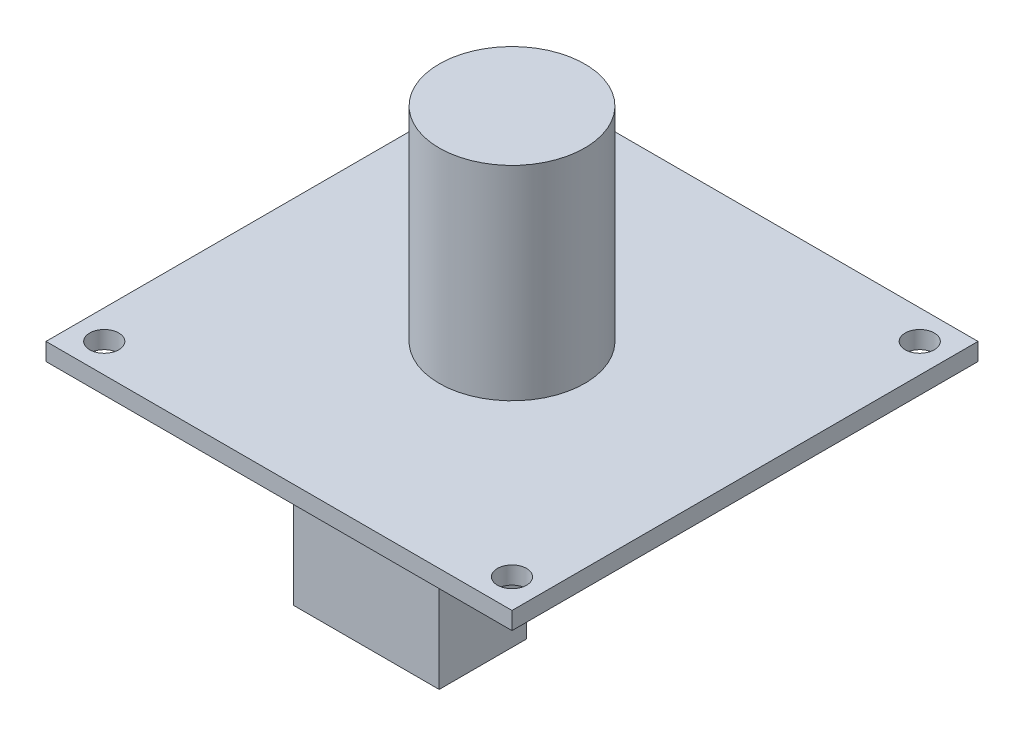
ISO-10303-21;
HEADER;
FILE_DESCRIPTION(('STEP AP214'),'2;1');
FILE_NAME('part.step','',(''),(''),'','','');
FILE_SCHEMA(('AUTOMOTIVE_DESIGN { 1 0 10303 214 1 1 1 1 }'));
ENDSEC;
DATA;
#1=APPLICATION_CONTEXT('core data for automotive mechanical design processes');
#2=APPLICATION_PROTOCOL_DEFINITION('international standard','automotive_design',2000,#1);
#3=PRODUCT_CONTEXT('',#1,'mechanical');
#4=PRODUCT('Part','Part','',(#3));
#5=PRODUCT_RELATED_PRODUCT_CATEGORY('part','',(#4));
#6=PRODUCT_DEFINITION_FORMATION('','',#4);
#7=PRODUCT_DEFINITION_CONTEXT('part definition',#1,'design');
#8=PRODUCT_DEFINITION('design','',#6,#7);
#9=PRODUCT_DEFINITION_SHAPE('','',#8);
#10=(LENGTH_UNIT() NAMED_UNIT(*) SI_UNIT(.MILLI.,.METRE.));
#11=(NAMED_UNIT(*) PLANE_ANGLE_UNIT() SI_UNIT($,.RADIAN.));
#12=(NAMED_UNIT(*) SI_UNIT($,.STERADIAN.) SOLID_ANGLE_UNIT());
#13=UNCERTAINTY_MEASURE_WITH_UNIT(LENGTH_MEASURE(1.E-05),#10,'distance_accuracy_value','');
#14=(GEOMETRIC_REPRESENTATION_CONTEXT(3) GLOBAL_UNCERTAINTY_ASSIGNED_CONTEXT((#13)) GLOBAL_UNIT_ASSIGNED_CONTEXT((#10,
#11,#12)) REPRESENTATION_CONTEXT('',''));
#15=CARTESIAN_POINT('',(0.,0.,0.));
#16=DIRECTION('',(0.,0.,1.));
#17=DIRECTION('',(1.,0.,0.));
#18=AXIS2_PLACEMENT_3D('',#15,#16,#17);
#19=CARTESIAN_POINT('',(0.,0.,0.));
#20=DIRECTION('',(0.,1.,0.));
#21=DIRECTION('',(0.,0.,1.));
#22=AXIS2_PLACEMENT_3D('',#19,#20,#21);
#23=PLANE('',#22);
#24=CARTESIAN_POINT('',(-14.,0.,14.));
#25=DIRECTION('',(0.,1.,0.));
#26=DIRECTION('',(0.,0.,1.));
#27=AXIS2_PLACEMENT_3D('',#24,#25,#26);
#28=CIRCLE('',#27,0.999999999999999);
#29=CARTESIAN_POINT('',(-14.,0.,15.));
#30=VERTEX_POINT('',#29);
#31=EDGE_CURVE('E130',#30,#30,#28,.T.);
#32=ORIENTED_EDGE('',*,*,#31,.T.);
#33=EDGE_LOOP('',(#32));
#34=FACE_BOUND('',#33,.T.);
#35=CARTESIAN_POINT('',(14.,0.,14.));
#36=DIRECTION('',(0.,1.,0.));
#37=DIRECTION('',(0.,0.,1.));
#38=AXIS2_PLACEMENT_3D('',#35,#36,#37);
#39=CIRCLE('',#38,1.);
#40=CARTESIAN_POINT('',(14.,0.,15.));
#41=VERTEX_POINT('',#40);
#42=EDGE_CURVE('E135',#41,#41,#39,.T.);
#43=ORIENTED_EDGE('',*,*,#42,.T.);
#44=EDGE_LOOP('',(#43));
#45=FACE_BOUND('',#44,.T.);
#46=CARTESIAN_POINT('',(14.,0.,-14.));
#47=DIRECTION('',(0.,1.,0.));
#48=DIRECTION('',(0.,0.,1.));
#49=AXIS2_PLACEMENT_3D('',#46,#47,#48);
#50=CIRCLE('',#49,1.);
#51=CARTESIAN_POINT('',(14.,0.,-13.));
#52=VERTEX_POINT('',#51);
#53=EDGE_CURVE('E141',#52,#52,#50,.T.);
#54=ORIENTED_EDGE('',*,*,#53,.T.);
#55=EDGE_LOOP('',(#54));
#56=FACE_BOUND('',#55,.T.);
#57=CARTESIAN_POINT('',(-14.,0.,-14.));
#58=DIRECTION('',(0.,1.,0.));
#59=DIRECTION('',(0.,0.,1.));
#60=AXIS2_PLACEMENT_3D('',#57,#58,#59);
#61=CIRCLE('',#60,1.);
#62=CARTESIAN_POINT('',(-14.,0.,-13.));
#63=VERTEX_POINT('',#62);
#64=EDGE_CURVE('E147',#63,#63,#61,.T.);
#65=ORIENTED_EDGE('',*,*,#64,.T.);
#66=EDGE_LOOP('',(#65));
#67=FACE_BOUND('',#66,.T.);
#68=DIRECTION('',(0.,0.,-1.));
#69=VECTOR('',#68,1.);
#70=CARTESIAN_POINT('',(16.,0.,-16.));
#71=LINE('',#70,#69);
#72=CARTESIAN_POINT('',(16.,0.,16.));
#73=VERTEX_POINT('',#72);
#74=CARTESIAN_POINT('',(16.,0.,-16.));
#75=VERTEX_POINT('',#74);
#76=EDGE_CURVE('E153',#73,#75,#71,.T.);
#77=ORIENTED_EDGE('',*,*,#76,.F.);
#78=DIRECTION('',(1.,0.,0.));
#79=VECTOR('',#78,1.);
#80=CARTESIAN_POINT('',(-16.,0.,16.));
#81=LINE('',#80,#79);
#82=CARTESIAN_POINT('',(-16.,0.,16.));
#83=VERTEX_POINT('',#82);
#84=EDGE_CURVE('E160',#83,#73,#81,.T.);
#85=ORIENTED_EDGE('',*,*,#84,.F.);
#86=DIRECTION('',(0.,0.,1.));
#87=VECTOR('',#86,1.);
#88=CARTESIAN_POINT('',(-16.,0.,-16.));
#89=LINE('',#88,#87);
#90=CARTESIAN_POINT('',(-16.,0.,-16.));
#91=VERTEX_POINT('',#90);
#92=EDGE_CURVE('E171',#91,#83,#89,.T.);
#93=ORIENTED_EDGE('',*,*,#92,.F.);
#94=DIRECTION('',(-1.,0.,0.));
#95=VECTOR('',#94,1.);
#96=CARTESIAN_POINT('',(-16.,0.,-16.));
#97=LINE('',#96,#95);
#98=EDGE_CURVE('E169',#75,#91,#97,.T.);
#99=ORIENTED_EDGE('',*,*,#98,.F.);
#100=EDGE_LOOP('',(#77,#85,#93,#99));
#101=FACE_BOUND('',#100,.T.);
#102=DIRECTION('',(0.,0.,1.));
#103=VECTOR('',#102,1.);
#104=CARTESIAN_POINT('',(9.00000000000001,0.,14.));
#105=LINE('',#104,#103);
#106=CARTESIAN_POINT('',(9.00000000000001,0.,8.));
#107=VERTEX_POINT('',#106);
#108=CARTESIAN_POINT('',(9.00000000000001,0.,14.));
#109=VERTEX_POINT('',#108);
#110=EDGE_CURVE('E119',#107,#109,#105,.T.);
#111=ORIENTED_EDGE('',*,*,#110,.F.);
#112=DIRECTION('',(1.,0.,0.));
#113=VECTOR('',#112,1.);
#114=CARTESIAN_POINT('',(-1.,0.,8.));
#115=LINE('',#114,#113);
#116=CARTESIAN_POINT('',(-1.,0.,8.));
#117=VERTEX_POINT('',#116);
#118=EDGE_CURVE('E116',#117,#107,#115,.T.);
#119=ORIENTED_EDGE('',*,*,#118,.F.);
#120=DIRECTION('',(0.,0.,-1.));
#121=VECTOR('',#120,1.);
#122=CARTESIAN_POINT('',(-1.,0.,14.));
#123=LINE('',#122,#121);
#124=CARTESIAN_POINT('',(-1.,0.,14.));
#125=VERTEX_POINT('',#124);
#126=EDGE_CURVE('E54',#125,#117,#123,.T.);
#127=ORIENTED_EDGE('',*,*,#126,.F.);
#128=DIRECTION('',(-1.,0.,0.));
#129=VECTOR('',#128,1.);
#130=CARTESIAN_POINT('',(-1.,0.,14.));
#131=LINE('',#130,#129);
#132=EDGE_CURVE('E49',#109,#125,#131,.T.);
#133=ORIENTED_EDGE('',*,*,#132,.F.);
#134=EDGE_LOOP('',(#111,#119,#127,#133));
#135=FACE_BOUND('',#134,.T.);
#136=ADVANCED_FACE('F34',(#34,#45,#56,#67,#101,#135),#23,.F.);
#137=CARTESIAN_POINT('',(0.,1.2,0.));
#138=DIRECTION('',(0.,1.,0.));
#139=DIRECTION('',(0.,0.,1.));
#140=AXIS2_PLACEMENT_3D('',#137,#138,#139);
#141=PLANE('',#140);
#142=CARTESIAN_POINT('',(0.,1.2,0.));
#143=DIRECTION('',(0.,1.,0.));
#144=DIRECTION('',(0.,0.,1.));
#145=AXIS2_PLACEMENT_3D('',#142,#143,#144);
#146=CIRCLE('',#145,5.);
#147=CARTESIAN_POINT('',(0.,1.2,5.));
#148=VERTEX_POINT('',#147);
#149=EDGE_CURVE('E120',#148,#148,#146,.T.);
#150=ORIENTED_EDGE('',*,*,#149,.F.);
#151=EDGE_LOOP('',(#150));
#152=FACE_BOUND('',#151,.T.);
#153=CARTESIAN_POINT('',(14.,1.2,14.));
#154=DIRECTION('',(0.,1.,0.));
#155=DIRECTION('',(0.,0.,1.));
#156=AXIS2_PLACEMENT_3D('',#153,#154,#155);
#157=CIRCLE('',#156,1.);
#158=CARTESIAN_POINT('',(14.,1.2,15.));
#159=VERTEX_POINT('',#158);
#160=EDGE_CURVE('E138',#159,#159,#157,.T.);
#161=ORIENTED_EDGE('',*,*,#160,.F.);
#162=EDGE_LOOP('',(#161));
#163=FACE_BOUND('',#162,.T.);
#164=CARTESIAN_POINT('',(-14.,1.2,-14.));
#165=DIRECTION('',(0.,1.,0.));
#166=DIRECTION('',(0.,0.,1.));
#167=AXIS2_PLACEMENT_3D('',#164,#165,#166);
#168=CIRCLE('',#167,1.);
#169=CARTESIAN_POINT('',(-14.,1.2,-13.));
#170=VERTEX_POINT('',#169);
#171=EDGE_CURVE('E150',#170,#170,#168,.T.);
#172=ORIENTED_EDGE('',*,*,#171,.F.);
#173=EDGE_LOOP('',(#172));
#174=FACE_BOUND('',#173,.T.);
#175=DIRECTION('',(0.,0.,-1.));
#176=VECTOR('',#175,1.);
#177=CARTESIAN_POINT('',(16.,1.2,-16.));
#178=LINE('',#177,#176);
#179=CARTESIAN_POINT('',(16.,1.2,16.));
#180=VERTEX_POINT('',#179);
#181=CARTESIAN_POINT('',(16.,1.2,-16.));
#182=VERTEX_POINT('',#181);
#183=EDGE_CURVE('E156',#180,#182,#178,.T.);
#184=ORIENTED_EDGE('',*,*,#183,.T.);
#185=DIRECTION('',(-1.,0.,0.));
#186=VECTOR('',#185,1.);
#187=CARTESIAN_POINT('',(-16.,1.2,-16.));
#188=LINE('',#187,#186);
#189=CARTESIAN_POINT('',(-16.,1.2,-16.));
#190=VERTEX_POINT('',#189);
#191=EDGE_CURVE('E159',#182,#190,#188,.T.);
#192=ORIENTED_EDGE('',*,*,#191,.T.);
#193=DIRECTION('',(0.,0.,1.));
#194=VECTOR('',#193,1.);
#195=CARTESIAN_POINT('',(-16.,1.2,-16.));
#196=LINE('',#195,#194);
#197=CARTESIAN_POINT('',(-16.,1.2,16.));
#198=VERTEX_POINT('',#197);
#199=EDGE_CURVE('E162',#190,#198,#196,.T.);
#200=ORIENTED_EDGE('',*,*,#199,.T.);
#201=DIRECTION('',(1.,0.,0.));
#202=VECTOR('',#201,1.);
#203=CARTESIAN_POINT('',(-16.,1.2,16.));
#204=LINE('',#203,#202);
#205=EDGE_CURVE('E164',#198,#180,#204,.T.);
#206=ORIENTED_EDGE('',*,*,#205,.T.);
#207=EDGE_LOOP('',(#184,#192,#200,#206));
#208=FACE_BOUND('',#207,.T.);
#209=CARTESIAN_POINT('',(14.,1.2,-14.));
#210=DIRECTION('',(0.,1.,0.));
#211=DIRECTION('',(0.,0.,1.));
#212=AXIS2_PLACEMENT_3D('',#209,#210,#211);
#213=CIRCLE('',#212,1.);
#214=CARTESIAN_POINT('',(14.,1.2,-13.));
#215=VERTEX_POINT('',#214);
#216=EDGE_CURVE('E144',#215,#215,#213,.T.);
#217=ORIENTED_EDGE('',*,*,#216,.F.);
#218=EDGE_LOOP('',(#217));
#219=FACE_BOUND('',#218,.T.);
#220=CARTESIAN_POINT('',(-14.,1.2,14.));
#221=DIRECTION('',(0.,1.,0.));
#222=DIRECTION('',(0.,0.,1.));
#223=AXIS2_PLACEMENT_3D('',#220,#221,#222);
#224=CIRCLE('',#223,0.999999999999999);
#225=CARTESIAN_POINT('',(-14.,1.2,15.));
#226=VERTEX_POINT('',#225);
#227=EDGE_CURVE('E132',#226,#226,#224,.T.);
#228=ORIENTED_EDGE('',*,*,#227,.F.);
#229=EDGE_LOOP('',(#228));
#230=FACE_BOUND('',#229,.T.);
#231=ADVANCED_FACE('F197',(#152,#163,#174,#208,#219,#230),#141,.T.);
#232=CARTESIAN_POINT('',(16.,1.2,-16.));
#233=DIRECTION('',(-1.,0.,0.));
#234=DIRECTION('',(0.,0.,1.));
#235=AXIS2_PLACEMENT_3D('',#232,#233,#234);
#236=PLANE('',#235);
#237=ORIENTED_EDGE('',*,*,#76,.T.);
#238=DIRECTION('',(0.,-1.,0.));
#239=VECTOR('',#238,1.);
#240=CARTESIAN_POINT('',(16.,1.2,-16.));
#241=LINE('',#240,#239);
#242=EDGE_CURVE('E11',#182,#75,#241,.T.);
#243=ORIENTED_EDGE('',*,*,#242,.F.);
#244=ORIENTED_EDGE('',*,*,#183,.F.);
#245=DIRECTION('',(0.,-1.,0.));
#246=VECTOR('',#245,1.);
#247=CARTESIAN_POINT('',(16.,1.2,16.));
#248=LINE('',#247,#246);
#249=EDGE_CURVE('E166',#180,#73,#248,.T.);
#250=ORIENTED_EDGE('',*,*,#249,.T.);
#251=EDGE_LOOP('',(#237,#243,#244,#250));
#252=FACE_BOUND('',#251,.T.);
#253=ADVANCED_FACE('F36',(#252),#236,.F.);
#254=CARTESIAN_POINT('',(-16.,1.2,-16.));
#255=DIRECTION('',(0.,0.,1.));
#256=DIRECTION('',(1.,0.,0.));
#257=AXIS2_PLACEMENT_3D('',#254,#255,#256);
#258=PLANE('',#257);
#259=ORIENTED_EDGE('',*,*,#98,.T.);
#260=DIRECTION('',(0.,-1.,0.));
#261=VECTOR('',#260,1.);
#262=CARTESIAN_POINT('',(-16.,1.2,-16.));
#263=LINE('',#262,#261);
#264=EDGE_CURVE('E42',#190,#91,#263,.T.);
#265=ORIENTED_EDGE('',*,*,#264,.F.);
#266=ORIENTED_EDGE('',*,*,#191,.F.);
#267=ORIENTED_EDGE('',*,*,#242,.T.);
#268=EDGE_LOOP('',(#259,#265,#266,#267));
#269=FACE_BOUND('',#268,.T.);
#270=ADVANCED_FACE('F199',(#269),#258,.F.);
#271=CARTESIAN_POINT('',(-16.,1.2,-16.));
#272=DIRECTION('',(1.,0.,0.));
#273=DIRECTION('',(0.,0.,-1.));
#274=AXIS2_PLACEMENT_3D('',#271,#272,#273);
#275=PLANE('',#274);
#276=ORIENTED_EDGE('',*,*,#92,.T.);
#277=DIRECTION('',(0.,-1.,0.));
#278=VECTOR('',#277,1.);
#279=CARTESIAN_POINT('',(-16.,1.2,16.));
#280=LINE('',#279,#278);
#281=EDGE_CURVE('E176',#198,#83,#280,.T.);
#282=ORIENTED_EDGE('',*,*,#281,.F.);
#283=ORIENTED_EDGE('',*,*,#199,.F.);
#284=ORIENTED_EDGE('',*,*,#264,.T.);
#285=EDGE_LOOP('',(#276,#282,#283,#284));
#286=FACE_BOUND('',#285,.T.);
#287=ADVANCED_FACE('F183',(#286),#275,.F.);
#288=CARTESIAN_POINT('',(-16.,1.2,16.));
#289=DIRECTION('',(0.,0.,-1.));
#290=DIRECTION('',(-1.,0.,0.));
#291=AXIS2_PLACEMENT_3D('',#288,#289,#290);
#292=PLANE('',#291);
#293=ORIENTED_EDGE('',*,*,#84,.T.);
#294=ORIENTED_EDGE('',*,*,#249,.F.);
#295=ORIENTED_EDGE('',*,*,#205,.F.);
#296=ORIENTED_EDGE('',*,*,#281,.T.);
#297=EDGE_LOOP('',(#293,#294,#295,#296));
#298=FACE_BOUND('',#297,.T.);
#299=ADVANCED_FACE('F191',(#298),#292,.F.);
#300=CARTESIAN_POINT('',(-14.,1.2,-14.));
#301=DIRECTION('',(0.,-1.,0.));
#302=DIRECTION('',(0.,0.,-1.));
#303=AXIS2_PLACEMENT_3D('',#300,#301,#302);
#304=CYLINDRICAL_SURFACE('',#303,1.);
#305=ORIENTED_EDGE('',*,*,#171,.T.);
#306=EDGE_LOOP('',(#305));
#307=FACE_BOUND('',#306,.T.);
#308=ORIENTED_EDGE('',*,*,#64,.F.);
#309=EDGE_LOOP('',(#308));
#310=FACE_BOUND('',#309,.T.);
#311=ADVANCED_FACE('F218',(#307,#310),#304,.F.);
#312=CARTESIAN_POINT('',(14.,1.2,-14.));
#313=DIRECTION('',(0.,-1.,0.));
#314=DIRECTION('',(0.,0.,-1.));
#315=AXIS2_PLACEMENT_3D('',#312,#313,#314);
#316=CYLINDRICAL_SURFACE('',#315,1.);
#317=ORIENTED_EDGE('',*,*,#216,.T.);
#318=EDGE_LOOP('',(#317));
#319=FACE_BOUND('',#318,.T.);
#320=ORIENTED_EDGE('',*,*,#53,.F.);
#321=EDGE_LOOP('',(#320));
#322=FACE_BOUND('',#321,.T.);
#323=ADVANCED_FACE('F222',(#319,#322),#316,.F.);
#324=CARTESIAN_POINT('',(14.,1.2,14.));
#325=DIRECTION('',(0.,-1.,0.));
#326=DIRECTION('',(0.,0.,-1.));
#327=AXIS2_PLACEMENT_3D('',#324,#325,#326);
#328=CYLINDRICAL_SURFACE('',#327,1.);
#329=ORIENTED_EDGE('',*,*,#160,.T.);
#330=EDGE_LOOP('',(#329));
#331=FACE_BOUND('',#330,.T.);
#332=ORIENTED_EDGE('',*,*,#42,.F.);
#333=EDGE_LOOP('',(#332));
#334=FACE_BOUND('',#333,.T.);
#335=ADVANCED_FACE('F227',(#331,#334),#328,.F.);
#336=CARTESIAN_POINT('',(-14.,1.2,14.));
#337=DIRECTION('',(0.,-1.,0.));
#338=DIRECTION('',(0.,0.,-1.));
#339=AXIS2_PLACEMENT_3D('',#336,#337,#338);
#340=CYLINDRICAL_SURFACE('',#339,0.999999999999999);
#341=ORIENTED_EDGE('',*,*,#227,.T.);
#342=EDGE_LOOP('',(#341));
#343=FACE_BOUND('',#342,.T.);
#344=ORIENTED_EDGE('',*,*,#31,.F.);
#345=EDGE_LOOP('',(#344));
#346=FACE_BOUND('',#345,.T.);
#347=ADVANCED_FACE('F234',(#343,#346),#340,.F.);
#348=CARTESIAN_POINT('',(0.,15.2,0.));
#349=DIRECTION('',(0.,-1.,0.));
#350=DIRECTION('',(0.,0.,-1.));
#351=AXIS2_PLACEMENT_3D('',#348,#349,#350);
#352=CYLINDRICAL_SURFACE('',#351,5.);
#353=CARTESIAN_POINT('',(0.,15.2,0.));
#354=DIRECTION('',(0.,1.,0.));
#355=DIRECTION('',(0.,0.,1.));
#356=AXIS2_PLACEMENT_3D('',#353,#354,#355);
#357=CIRCLE('',#356,5.);
#358=CARTESIAN_POINT('',(0.,15.2,5.));
#359=VERTEX_POINT('',#358);
#360=EDGE_CURVE('E123',#359,#359,#357,.T.);
#361=ORIENTED_EDGE('',*,*,#360,.F.);
#362=EDGE_LOOP('',(#361));
#363=FACE_BOUND('',#362,.T.);
#364=ORIENTED_EDGE('',*,*,#149,.T.);
#365=EDGE_LOOP('',(#364));
#366=FACE_BOUND('',#365,.T.);
#367=ADVANCED_FACE('F238',(#363,#366),#352,.T.);
#368=CARTESIAN_POINT('',(0.,15.2,0.));
#369=DIRECTION('',(0.,1.,0.));
#370=DIRECTION('',(0.,0.,1.));
#371=AXIS2_PLACEMENT_3D('',#368,#369,#370);
#372=PLANE('',#371);
#373=ORIENTED_EDGE('',*,*,#360,.T.);
#374=EDGE_LOOP('',(#373));
#375=FACE_BOUND('',#374,.T.);
#376=ADVANCED_FACE('F242',(#375),#372,.T.);
#377=CARTESIAN_POINT('',(9.00000000000001,-8.,14.));
#378=DIRECTION('',(-1.,0.,0.));
#379=DIRECTION('',(0.,0.,1.));
#380=AXIS2_PLACEMENT_3D('',#377,#378,#379);
#381=PLANE('',#380);
#382=ORIENTED_EDGE('',*,*,#110,.T.);
#383=DIRECTION('',(0.,1.,0.));
#384=VECTOR('',#383,1.);
#385=CARTESIAN_POINT('',(9.00000000000001,-8.,14.));
#386=LINE('',#385,#384);
#387=CARTESIAN_POINT('',(9.00000000000001,-8.,14.));
#388=VERTEX_POINT('',#387);
#389=EDGE_CURVE('E100',#388,#109,#386,.T.);
#390=ORIENTED_EDGE('',*,*,#389,.F.);
#391=DIRECTION('',(0.,0.,1.));
#392=VECTOR('',#391,1.);
#393=CARTESIAN_POINT('',(9.00000000000001,-8.,14.));
#394=LINE('',#393,#392);
#395=CARTESIAN_POINT('',(9.00000000000001,-8.,8.));
#396=VERTEX_POINT('',#395);
#397=EDGE_CURVE('E107',#396,#388,#394,.T.);
#398=ORIENTED_EDGE('',*,*,#397,.F.);
#399=DIRECTION('',(0.,1.,0.));
#400=VECTOR('',#399,1.);
#401=CARTESIAN_POINT('',(9.00000000000001,-8.,8.));
#402=LINE('',#401,#400);
#403=EDGE_CURVE('E356',#396,#107,#402,.T.);
#404=ORIENTED_EDGE('',*,*,#403,.T.);
#405=EDGE_LOOP('',(#382,#390,#398,#404));
#406=FACE_BOUND('',#405,.T.);
#407=ADVANCED_FACE('F118',(#406),#381,.F.);
#408=CARTESIAN_POINT('',(-1.,-8.,14.));
#409=DIRECTION('',(0.,0.,-1.));
#410=DIRECTION('',(-1.,0.,0.));
#411=AXIS2_PLACEMENT_3D('',#408,#409,#410);
#412=PLANE('',#411);
#413=ORIENTED_EDGE('',*,*,#132,.T.);
#414=DIRECTION('',(0.,1.,0.));
#415=VECTOR('',#414,1.);
#416=CARTESIAN_POINT('',(-1.,-8.,14.));
#417=LINE('',#416,#415);
#418=CARTESIAN_POINT('',(-1.,-8.,14.));
#419=VERTEX_POINT('',#418);
#420=EDGE_CURVE('E103',#419,#125,#417,.T.);
#421=ORIENTED_EDGE('',*,*,#420,.F.);
#422=DIRECTION('',(-1.,0.,0.));
#423=VECTOR('',#422,1.);
#424=CARTESIAN_POINT('',(-1.,-8.,14.));
#425=LINE('',#424,#423);
#426=EDGE_CURVE('E96',#388,#419,#425,.T.);
#427=ORIENTED_EDGE('',*,*,#426,.F.);
#428=ORIENTED_EDGE('',*,*,#389,.T.);
#429=EDGE_LOOP('',(#413,#421,#427,#428));
#430=FACE_BOUND('',#429,.T.);
#431=ADVANCED_FACE('F98',(#430),#412,.F.);
#432=CARTESIAN_POINT('',(-1.,-8.,14.));
#433=DIRECTION('',(1.,0.,0.));
#434=DIRECTION('',(0.,0.,-1.));
#435=AXIS2_PLACEMENT_3D('',#432,#433,#434);
#436=PLANE('',#435);
#437=ORIENTED_EDGE('',*,*,#126,.T.);
#438=DIRECTION('',(0.,1.,0.));
#439=VECTOR('',#438,1.);
#440=CARTESIAN_POINT('',(-1.,-8.,8.));
#441=LINE('',#440,#439);
#442=CARTESIAN_POINT('',(-1.,-8.,8.));
#443=VERTEX_POINT('',#442);
#444=EDGE_CURVE('E125',#443,#117,#441,.T.);
#445=ORIENTED_EDGE('',*,*,#444,.F.);
#446=DIRECTION('',(0.,0.,-1.));
#447=VECTOR('',#446,1.);
#448=CARTESIAN_POINT('',(-1.,-8.,14.));
#449=LINE('',#448,#447);
#450=EDGE_CURVE('E106',#419,#443,#449,.T.);
#451=ORIENTED_EDGE('',*,*,#450,.F.);
#452=ORIENTED_EDGE('',*,*,#420,.T.);
#453=EDGE_LOOP('',(#437,#445,#451,#452));
#454=FACE_BOUND('',#453,.T.);
#455=ADVANCED_FACE('F251',(#454),#436,.F.);
#456=CARTESIAN_POINT('',(-1.,-8.,8.));
#457=DIRECTION('',(0.,0.,1.));
#458=DIRECTION('',(1.,0.,0.));
#459=AXIS2_PLACEMENT_3D('',#456,#457,#458);
#460=PLANE('',#459);
#461=ORIENTED_EDGE('',*,*,#118,.T.);
#462=ORIENTED_EDGE('',*,*,#403,.F.);
#463=DIRECTION('',(1.,0.,0.));
#464=VECTOR('',#463,1.);
#465=CARTESIAN_POINT('',(-1.,-8.,8.));
#466=LINE('',#465,#464);
#467=EDGE_CURVE('E112',#443,#396,#466,.T.);
#468=ORIENTED_EDGE('',*,*,#467,.F.);
#469=ORIENTED_EDGE('',*,*,#444,.T.);
#470=EDGE_LOOP('',(#461,#462,#468,#469));
#471=FACE_BOUND('',#470,.T.);
#472=ADVANCED_FACE('F254',(#471),#460,.F.);
#473=CARTESIAN_POINT('',(0.,-8.,0.));
#474=DIRECTION('',(0.,-1.,0.));
#475=DIRECTION('',(0.,0.,-1.));
#476=AXIS2_PLACEMENT_3D('',#473,#474,#475);
#477=PLANE('',#476);
#478=ORIENTED_EDGE('',*,*,#397,.T.);
#479=ORIENTED_EDGE('',*,*,#426,.T.);
#480=ORIENTED_EDGE('',*,*,#450,.T.);
#481=ORIENTED_EDGE('',*,*,#467,.T.);
#482=EDGE_LOOP('',(#478,#479,#480,#481));
#483=FACE_BOUND('',#482,.T.);
#484=ADVANCED_FACE('F110',(#483),#477,.T.);
#485=CLOSED_SHELL('',(#136,#231,#253,#270,#287,#299,#311,#323,#335,#347,#367,#376,#407,#431,
#455,#472,#484));
#486=MANIFOLD_SOLID_BREP('B2',#485);
#487=ADVANCED_BREP_SHAPE_REPRESENTATION('',(#18,#486),#14);
#488=SHAPE_DEFINITION_REPRESENTATION(#9,#487);
ENDSEC;
END-ISO-10303-21;
